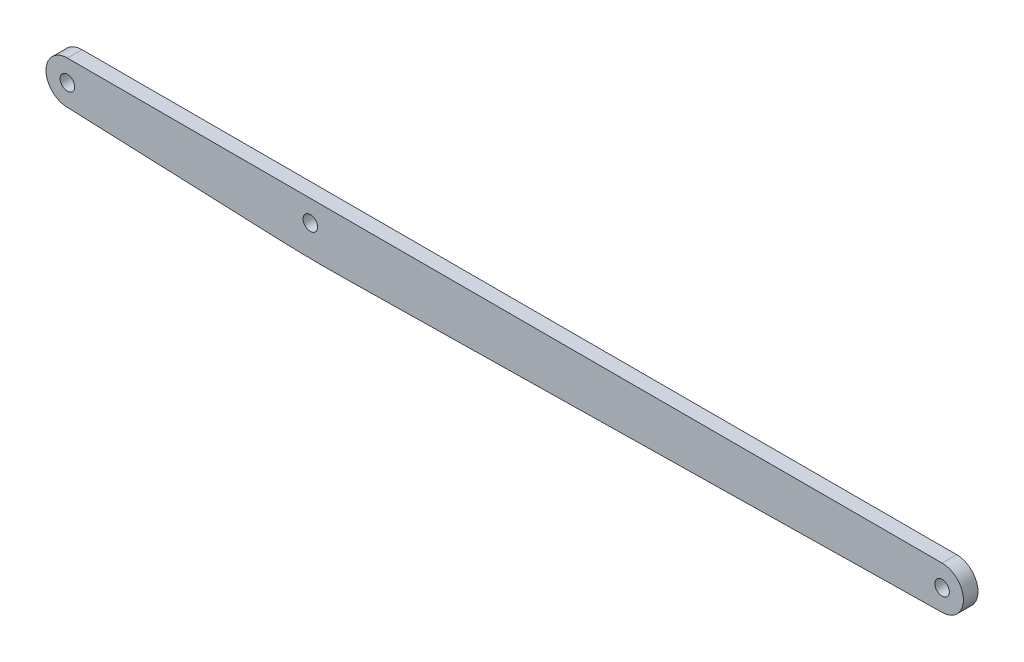
ISO-10303-21;
HEADER;
FILE_DESCRIPTION(('STEP AP214'),'2;1');
FILE_NAME('part.step','',(''),(''),'','','');
FILE_SCHEMA(('AUTOMOTIVE_DESIGN { 1 0 10303 214 1 1 1 1 }'));
ENDSEC;
DATA;
#1=APPLICATION_CONTEXT('core data for automotive mechanical design processes');
#2=APPLICATION_PROTOCOL_DEFINITION('international standard','automotive_design',2000,#1);
#3=PRODUCT_CONTEXT('',#1,'mechanical');
#4=PRODUCT('Part','Part','',(#3));
#5=PRODUCT_RELATED_PRODUCT_CATEGORY('part','',(#4));
#6=PRODUCT_DEFINITION_FORMATION('','',#4);
#7=PRODUCT_DEFINITION_CONTEXT('part definition',#1,'design');
#8=PRODUCT_DEFINITION('design','',#6,#7);
#9=PRODUCT_DEFINITION_SHAPE('','',#8);
#10=(LENGTH_UNIT() NAMED_UNIT(*) SI_UNIT(.MILLI.,.METRE.));
#11=(NAMED_UNIT(*) PLANE_ANGLE_UNIT() SI_UNIT($,.RADIAN.));
#12=(NAMED_UNIT(*) SI_UNIT($,.STERADIAN.) SOLID_ANGLE_UNIT());
#13=UNCERTAINTY_MEASURE_WITH_UNIT(LENGTH_MEASURE(1.E-05),#10,'distance_accuracy_value','');
#14=(GEOMETRIC_REPRESENTATION_CONTEXT(3) GLOBAL_UNCERTAINTY_ASSIGNED_CONTEXT((#13)) GLOBAL_UNIT_ASSIGNED_CONTEXT((#10,
#11,#12)) REPRESENTATION_CONTEXT('',''));
#15=CARTESIAN_POINT('',(0.,0.,0.));
#16=DIRECTION('',(0.,0.,1.));
#17=DIRECTION('',(1.,0.,0.));
#18=AXIS2_PLACEMENT_3D('',#15,#16,#17);
#19=CARTESIAN_POINT('',(-91.1896549822188,-0.514866374512934,-4.5));
#20=DIRECTION('',(0.,0.,1.));
#21=DIRECTION('',(1.,0.,0.));
#22=AXIS2_PLACEMENT_3D('',#19,#20,#21);
#23=CYLINDRICAL_SURFACE('',#22,4.39597624530359);
#24=CARTESIAN_POINT('',(-91.1896549822188,-0.514866374512934,-1.5));
#25=DIRECTION('',(0.,0.,1.));
#26=DIRECTION('',(1.,0.,0.));
#27=AXIS2_PLACEMENT_3D('',#24,#25,#26);
#28=CIRCLE('',#27,4.39597624530359);
#29=CARTESIAN_POINT('',(-91.1896549822188,3.88110987079066,-1.5));
#30=VERTEX_POINT('',#29);
#31=CARTESIAN_POINT('',(-91.1896549822188,-4.91084261981653,-1.5));
#32=VERTEX_POINT('',#31);
#33=EDGE_CURVE('E122',#30,#32,#28,.T.);
#34=ORIENTED_EDGE('',*,*,#33,.F.);
#35=DIRECTION('',(0.,0.,1.));
#36=VECTOR('',#35,1.);
#37=CARTESIAN_POINT('',(-91.1896549822188,3.88110987079066,-4.5));
#38=LINE('',#37,#36);
#39=CARTESIAN_POINT('',(-91.1896549822188,3.88110987079066,-4.5));
#40=VERTEX_POINT('',#39);
#41=EDGE_CURVE('E11',#40,#30,#38,.T.);
#42=ORIENTED_EDGE('',*,*,#41,.F.);
#43=CARTESIAN_POINT('',(-91.1896549822188,-0.514866374512934,-4.5));
#44=DIRECTION('',(0.,0.,1.));
#45=DIRECTION('',(1.,0.,0.));
#46=AXIS2_PLACEMENT_3D('',#43,#44,#45);
#47=CIRCLE('',#46,4.39597624530359);
#48=CARTESIAN_POINT('',(-91.1896549822188,-4.91084261981653,-4.5));
#49=VERTEX_POINT('',#48);
#50=EDGE_CURVE('E137',#40,#49,#47,.T.);
#51=ORIENTED_EDGE('',*,*,#50,.T.);
#52=DIRECTION('',(0.,0.,1.));
#53=VECTOR('',#52,1.);
#54=CARTESIAN_POINT('',(-91.1896549822188,-4.91084261981653,-4.5));
#55=LINE('',#54,#53);
#56=EDGE_CURVE('E40',#49,#32,#55,.T.);
#57=ORIENTED_EDGE('',*,*,#56,.T.);
#58=EDGE_LOOP('',(#34,#42,#51,#57));
#59=FACE_BOUND('',#58,.T.);
#60=ADVANCED_FACE('F37',(#59),#23,.T.);
#61=CARTESIAN_POINT('',(-91.1896549822188,3.88110987079066,-4.5));
#62=DIRECTION('',(0.,1.,0.));
#63=DIRECTION('',(-1.,0.,0.));
#64=AXIS2_PLACEMENT_3D('',#61,#62,#63);
#65=PLANE('',#64);
#66=DIRECTION('',(-1.,0.,0.));
#67=VECTOR('',#66,1.);
#68=CARTESIAN_POINT('',(-91.1896549822188,3.88110987079066,-1.5));
#69=LINE('',#68,#67);
#70=CARTESIAN_POINT('',(88.8103450177812,3.88110987079069,-1.5));
#71=VERTEX_POINT('',#70);
#72=EDGE_CURVE('E135',#71,#30,#69,.T.);
#73=ORIENTED_EDGE('',*,*,#72,.F.);
#74=DIRECTION('',(0.,0.,1.));
#75=VECTOR('',#74,1.);
#76=CARTESIAN_POINT('',(88.8103450177812,3.88110987079069,-4.5));
#77=LINE('',#76,#75);
#78=CARTESIAN_POINT('',(88.8103450177812,3.88110987079069,-4.5));
#79=VERTEX_POINT('',#78);
#80=EDGE_CURVE('E46',#79,#71,#77,.T.);
#81=ORIENTED_EDGE('',*,*,#80,.F.);
#82=DIRECTION('',(-1.,0.,0.));
#83=VECTOR('',#82,1.);
#84=CARTESIAN_POINT('',(-91.1896549822188,3.88110987079066,-4.5));
#85=LINE('',#84,#83);
#86=EDGE_CURVE('E112',#79,#40,#85,.T.);
#87=ORIENTED_EDGE('',*,*,#86,.T.);
#88=ORIENTED_EDGE('',*,*,#41,.T.);
#89=EDGE_LOOP('',(#73,#81,#87,#88));
#90=FACE_BOUND('',#89,.T.);
#91=ADVANCED_FACE('F145',(#90),#65,.T.);
#92=CARTESIAN_POINT('',(88.8103450177812,-0.514866374512901,-4.5));
#93=DIRECTION('',(0.,0.,1.));
#94=DIRECTION('',(1.,0.,0.));
#95=AXIS2_PLACEMENT_3D('',#92,#93,#94);
#96=CYLINDRICAL_SURFACE('',#95,4.39597624530359);
#97=CARTESIAN_POINT('',(88.8103450177812,-0.514866374512901,-1.5));
#98=DIRECTION('',(0.,0.,1.));
#99=DIRECTION('',(1.,0.,0.));
#100=AXIS2_PLACEMENT_3D('',#97,#98,#99);
#101=CIRCLE('',#100,4.39597624530359);
#102=CARTESIAN_POINT('',(88.8103450177812,-4.91084261981649,-1.5));
#103=VERTEX_POINT('',#102);
#104=EDGE_CURVE('E99',#103,#71,#101,.T.);
#105=ORIENTED_EDGE('',*,*,#104,.F.);
#106=DIRECTION('',(0.,0.,1.));
#107=VECTOR('',#106,1.);
#108=CARTESIAN_POINT('',(88.8103450177812,-4.91084261981649,-4.5));
#109=LINE('',#108,#107);
#110=CARTESIAN_POINT('',(88.8103450177812,-4.91084261981649,-4.5));
#111=VERTEX_POINT('',#110);
#112=EDGE_CURVE('E94',#111,#103,#109,.T.);
#113=ORIENTED_EDGE('',*,*,#112,.F.);
#114=CARTESIAN_POINT('',(88.8103450177812,-0.514866374512901,-4.5));
#115=DIRECTION('',(0.,0.,1.));
#116=DIRECTION('',(1.,0.,0.));
#117=AXIS2_PLACEMENT_3D('',#114,#115,#116);
#118=CIRCLE('',#117,4.39597624530359);
#119=EDGE_CURVE('E97',#111,#79,#118,.T.);
#120=ORIENTED_EDGE('',*,*,#119,.T.);
#121=ORIENTED_EDGE('',*,*,#80,.T.);
#122=EDGE_LOOP('',(#105,#113,#120,#121));
#123=FACE_BOUND('',#122,.T.);
#124=ADVANCED_FACE('F96',(#123),#96,.T.);
#125=CARTESIAN_POINT('',(-34.1266770194756,-6.84094343604562,-4.5));
#126=DIRECTION('',(0.0156979806042919,-0.99987677911078,0.));
#127=DIRECTION('',(0.99987677911078,0.0156979806042919,0.));
#128=AXIS2_PLACEMENT_3D('',#125,#126,#127);
#129=PLANE('',#128);
#130=DIRECTION('',(0.99987677911078,0.0156979806042919,0.));
#131=VECTOR('',#130,1.);
#132=CARTESIAN_POINT('',(-34.1266770194756,-6.84094343604562,-1.5));
#133=LINE('',#132,#131);
#134=CARTESIAN_POINT('',(-34.1266770194756,-6.84094343604562,-1.5));
#135=VERTEX_POINT('',#134);
#136=EDGE_CURVE('E132',#135,#103,#133,.T.);
#137=ORIENTED_EDGE('',*,*,#136,.F.);
#138=DIRECTION('',(0.,0.,1.));
#139=VECTOR('',#138,1.);
#140=CARTESIAN_POINT('',(-34.1266770194756,-6.84094343604562,-4.5));
#141=LINE('',#140,#139);
#142=CARTESIAN_POINT('',(-34.1266770194756,-6.84094343604562,-4.5));
#143=VERTEX_POINT('',#142);
#144=EDGE_CURVE('E104',#143,#135,#141,.T.);
#145=ORIENTED_EDGE('',*,*,#144,.F.);
#146=DIRECTION('',(0.99987677911078,0.0156979806042919,0.));
#147=VECTOR('',#146,1.);
#148=CARTESIAN_POINT('',(-34.1266770194756,-6.84094343604562,-4.5));
#149=LINE('',#148,#147);
#150=EDGE_CURVE('E110',#143,#111,#149,.T.);
#151=ORIENTED_EDGE('',*,*,#150,.T.);
#152=ORIENTED_EDGE('',*,*,#112,.T.);
#153=EDGE_LOOP('',(#137,#145,#151,#152));
#154=FACE_BOUND('',#153,.T.);
#155=ADVANCED_FACE('F114',(#154),#129,.T.);
#156=CARTESIAN_POINT('',(-38.0511721705492,243.128251341649,-4.5));
#157=DIRECTION('',(0.,0.,1.));
#158=DIRECTION('',(1.,0.,0.));
#159=AXIS2_PLACEMENT_3D('',#156,#157,#158);
#160=CYLINDRICAL_SURFACE('',#159,250.);
#161=CARTESIAN_POINT('',(-38.0511721705492,243.128251341649,-1.5));
#162=DIRECTION('',(0.,0.,1.));
#163=DIRECTION('',(1.,0.,0.));
#164=AXIS2_PLACEMENT_3D('',#161,#162,#163);
#165=CIRCLE('',#164,250.);
#166=CARTESIAN_POINT('',(-48.2476256187881,-6.66372678630798,-1.5));
#167=VERTEX_POINT('',#166);
#168=EDGE_CURVE('E129',#167,#135,#165,.T.);
#169=ORIENTED_EDGE('',*,*,#168,.F.);
#170=DIRECTION('',(0.,0.,1.));
#171=VECTOR('',#170,1.);
#172=CARTESIAN_POINT('',(-48.2476256187881,-6.66372678630798,-4.5));
#173=LINE('',#172,#171);
#174=CARTESIAN_POINT('',(-48.2476256187881,-6.66372678630798,-4.5));
#175=VERTEX_POINT('',#174);
#176=EDGE_CURVE('E140',#175,#167,#173,.T.);
#177=ORIENTED_EDGE('',*,*,#176,.F.);
#178=CARTESIAN_POINT('',(-38.0511721705492,243.128251341649,-4.5));
#179=DIRECTION('',(0.,0.,1.));
#180=DIRECTION('',(1.,0.,0.));
#181=AXIS2_PLACEMENT_3D('',#178,#179,#180);
#182=CIRCLE('',#181,250.);
#183=EDGE_CURVE('E115',#175,#143,#182,.T.);
#184=ORIENTED_EDGE('',*,*,#183,.T.);
#185=ORIENTED_EDGE('',*,*,#144,.T.);
#186=EDGE_LOOP('',(#169,#177,#184,#185));
#187=FACE_BOUND('',#186,.T.);
#188=ADVANCED_FACE('F158',(#187),#160,.T.);
#189=CARTESIAN_POINT('',(-91.1896549822188,-4.91084261981653,-4.5));
#190=DIRECTION('',(-0.0407858137929505,-0.999167912511829,0.));
#191=DIRECTION('',(0.99916791251183,-0.0407858137929505,0.));
#192=AXIS2_PLACEMENT_3D('',#189,#190,#191);
#193=PLANE('',#192);
#194=DIRECTION('',(0.999167912511829,-0.0407858137929505,0.));
#195=VECTOR('',#194,1.);
#196=CARTESIAN_POINT('',(-91.1896549822188,-4.91084261981653,-1.5));
#197=LINE('',#196,#195);
#198=EDGE_CURVE('E125',#32,#167,#197,.T.);
#199=ORIENTED_EDGE('',*,*,#198,.F.);
#200=ORIENTED_EDGE('',*,*,#56,.F.);
#201=DIRECTION('',(0.999167912511829,-0.0407858137929505,0.));
#202=VECTOR('',#201,1.);
#203=CARTESIAN_POINT('',(-91.1896549822188,-4.91084261981653,-4.5));
#204=LINE('',#203,#202);
#205=EDGE_CURVE('E117',#49,#175,#204,.T.);
#206=ORIENTED_EDGE('',*,*,#205,.T.);
#207=ORIENTED_EDGE('',*,*,#176,.T.);
#208=EDGE_LOOP('',(#199,#200,#206,#207));
#209=FACE_BOUND('',#208,.T.);
#210=ADVANCED_FACE('F142',(#209),#193,.T.);
#211=CARTESIAN_POINT('',(-91.1896549822188,-0.514866374512934,-4.5));
#212=DIRECTION('',(0.,0.,1.));
#213=DIRECTION('',(1.,0.,0.));
#214=AXIS2_PLACEMENT_3D('',#211,#212,#213);
#215=PLANE('',#214);
#216=CARTESIAN_POINT('',(88.8103450177812,-0.514866374512901,-4.5));
#217=DIRECTION('',(0.,0.,1.));
#218=DIRECTION('',(1.,0.,0.));
#219=AXIS2_PLACEMENT_3D('',#216,#217,#218);
#220=CIRCLE('',#219,1.5);
#221=CARTESIAN_POINT('',(90.3103450177812,-0.514866374512901,-4.5));
#222=VERTEX_POINT('',#221);
#223=EDGE_CURVE('E188',#222,#222,#220,.T.);
#224=ORIENTED_EDGE('',*,*,#223,.T.);
#225=EDGE_LOOP('',(#224));
#226=FACE_BOUND('',#225,.T.);
#227=CARTESIAN_POINT('',(-41.1896549822188,-0.514866374512934,-4.5));
#228=DIRECTION('',(0.,0.,1.));
#229=DIRECTION('',(1.,0.,0.));
#230=AXIS2_PLACEMENT_3D('',#227,#228,#229);
#231=CIRCLE('',#230,1.5);
#232=CARTESIAN_POINT('',(-39.6896549822188,-0.514866374512934,-4.5));
#233=VERTEX_POINT('',#232);
#234=EDGE_CURVE('E196',#233,#233,#231,.T.);
#235=ORIENTED_EDGE('',*,*,#234,.T.);
#236=EDGE_LOOP('',(#235));
#237=FACE_BOUND('',#236,.T.);
#238=CARTESIAN_POINT('',(-91.1896549822188,-0.514866374512934,-4.5));
#239=DIRECTION('',(0.,0.,1.));
#240=DIRECTION('',(1.,0.,0.));
#241=AXIS2_PLACEMENT_3D('',#238,#239,#240);
#242=CIRCLE('',#241,1.5);
#243=CARTESIAN_POINT('',(-89.6896549822188,-0.514866374512934,-4.5));
#244=VERTEX_POINT('',#243);
#245=EDGE_CURVE('E126',#244,#244,#242,.T.);
#246=ORIENTED_EDGE('',*,*,#245,.T.);
#247=EDGE_LOOP('',(#246));
#248=FACE_BOUND('',#247,.T.);
#249=ORIENTED_EDGE('',*,*,#50,.F.);
#250=ORIENTED_EDGE('',*,*,#86,.F.);
#251=ORIENTED_EDGE('',*,*,#119,.F.);
#252=ORIENTED_EDGE('',*,*,#150,.F.);
#253=ORIENTED_EDGE('',*,*,#183,.F.);
#254=ORIENTED_EDGE('',*,*,#205,.F.);
#255=EDGE_LOOP('',(#249,#250,#251,#252,#253,#254));
#256=FACE_BOUND('',#255,.T.);
#257=ADVANCED_FACE('F108',(#226,#237,#248,#256),#215,.F.);
#258=CARTESIAN_POINT('',(-91.1896549822188,-0.514866374512934,-1.5));
#259=DIRECTION('',(0.,0.,1.));
#260=DIRECTION('',(1.,0.,0.));
#261=AXIS2_PLACEMENT_3D('',#258,#259,#260);
#262=PLANE('',#261);
#263=CARTESIAN_POINT('',(88.8103450177812,-0.514866374512901,-1.5));
#264=DIRECTION('',(0.,0.,1.));
#265=DIRECTION('',(1.,0.,0.));
#266=AXIS2_PLACEMENT_3D('',#263,#264,#265);
#267=CIRCLE('',#266,1.5);
#268=CARTESIAN_POINT('',(90.3103450177812,-0.514866374512901,-1.5));
#269=VERTEX_POINT('',#268);
#270=EDGE_CURVE('E191',#269,#269,#267,.T.);
#271=ORIENTED_EDGE('',*,*,#270,.F.);
#272=EDGE_LOOP('',(#271));
#273=FACE_BOUND('',#272,.T.);
#274=CARTESIAN_POINT('',(-41.1896549822188,-0.514866374512934,-1.5));
#275=DIRECTION('',(0.,0.,1.));
#276=DIRECTION('',(1.,0.,0.));
#277=AXIS2_PLACEMENT_3D('',#274,#275,#276);
#278=CIRCLE('',#277,1.5);
#279=CARTESIAN_POINT('',(-39.6896549822188,-0.514866374512934,-1.5));
#280=VERTEX_POINT('',#279);
#281=EDGE_CURVE('E193',#280,#280,#278,.T.);
#282=ORIENTED_EDGE('',*,*,#281,.F.);
#283=EDGE_LOOP('',(#282));
#284=FACE_BOUND('',#283,.T.);
#285=CARTESIAN_POINT('',(-91.1896549822188,-0.514866374512934,-1.5));
#286=DIRECTION('',(0.,0.,1.));
#287=DIRECTION('',(1.,0.,0.));
#288=AXIS2_PLACEMENT_3D('',#285,#286,#287);
#289=CIRCLE('',#288,1.5);
#290=CARTESIAN_POINT('',(-89.6896549822188,-0.514866374512934,-1.5));
#291=VERTEX_POINT('',#290);
#292=EDGE_CURVE('E199',#291,#291,#289,.T.);
#293=ORIENTED_EDGE('',*,*,#292,.F.);
#294=EDGE_LOOP('',(#293));
#295=FACE_BOUND('',#294,.T.);
#296=ORIENTED_EDGE('',*,*,#33,.T.);
#297=ORIENTED_EDGE('',*,*,#198,.T.);
#298=ORIENTED_EDGE('',*,*,#168,.T.);
#299=ORIENTED_EDGE('',*,*,#136,.T.);
#300=ORIENTED_EDGE('',*,*,#104,.T.);
#301=ORIENTED_EDGE('',*,*,#72,.T.);
#302=EDGE_LOOP('',(#296,#297,#298,#299,#300,#301));
#303=FACE_BOUND('',#302,.T.);
#304=ADVANCED_FACE('F144',(#273,#284,#295,#303),#262,.T.);
#305=CARTESIAN_POINT('',(-91.1896549822188,-0.514866374512934,-4.5));
#306=DIRECTION('',(0.,0.,1.));
#307=DIRECTION('',(1.,0.,0.));
#308=AXIS2_PLACEMENT_3D('',#305,#306,#307);
#309=CYLINDRICAL_SURFACE('',#308,1.5);
#310=ORIENTED_EDGE('',*,*,#245,.F.);
#311=EDGE_LOOP('',(#310));
#312=FACE_BOUND('',#311,.T.);
#313=ORIENTED_EDGE('',*,*,#292,.T.);
#314=EDGE_LOOP('',(#313));
#315=FACE_BOUND('',#314,.T.);
#316=ADVANCED_FACE('F169',(#312,#315),#309,.F.);
#317=CARTESIAN_POINT('',(-41.1896549822188,-0.514866374512934,-4.5));
#318=DIRECTION('',(0.,0.,1.));
#319=DIRECTION('',(1.,0.,0.));
#320=AXIS2_PLACEMENT_3D('',#317,#318,#319);
#321=CYLINDRICAL_SURFACE('',#320,1.5);
#322=ORIENTED_EDGE('',*,*,#234,.F.);
#323=EDGE_LOOP('',(#322));
#324=FACE_BOUND('',#323,.T.);
#325=ORIENTED_EDGE('',*,*,#281,.T.);
#326=EDGE_LOOP('',(#325));
#327=FACE_BOUND('',#326,.T.);
#328=ADVANCED_FACE('F176',(#324,#327),#321,.F.);
#329=CARTESIAN_POINT('',(88.8103450177812,-0.514866374512901,-4.5));
#330=DIRECTION('',(0.,0.,1.));
#331=DIRECTION('',(1.,0.,0.));
#332=AXIS2_PLACEMENT_3D('',#329,#330,#331);
#333=CYLINDRICAL_SURFACE('',#332,1.5);
#334=ORIENTED_EDGE('',*,*,#223,.F.);
#335=EDGE_LOOP('',(#334));
#336=FACE_BOUND('',#335,.T.);
#337=ORIENTED_EDGE('',*,*,#270,.T.);
#338=EDGE_LOOP('',(#337));
#339=FACE_BOUND('',#338,.T.);
#340=ADVANCED_FACE('F180',(#336,#339),#333,.F.);
#341=CLOSED_SHELL('',(#60,#91,#124,#155,#188,#210,#257,#304,#316,#328,#340));
#342=MANIFOLD_SOLID_BREP('B2',#341);
#343=ADVANCED_BREP_SHAPE_REPRESENTATION('',(#18,#342),#14);
#344=SHAPE_DEFINITION_REPRESENTATION(#9,#343);
ENDSEC;
END-ISO-10303-21;
